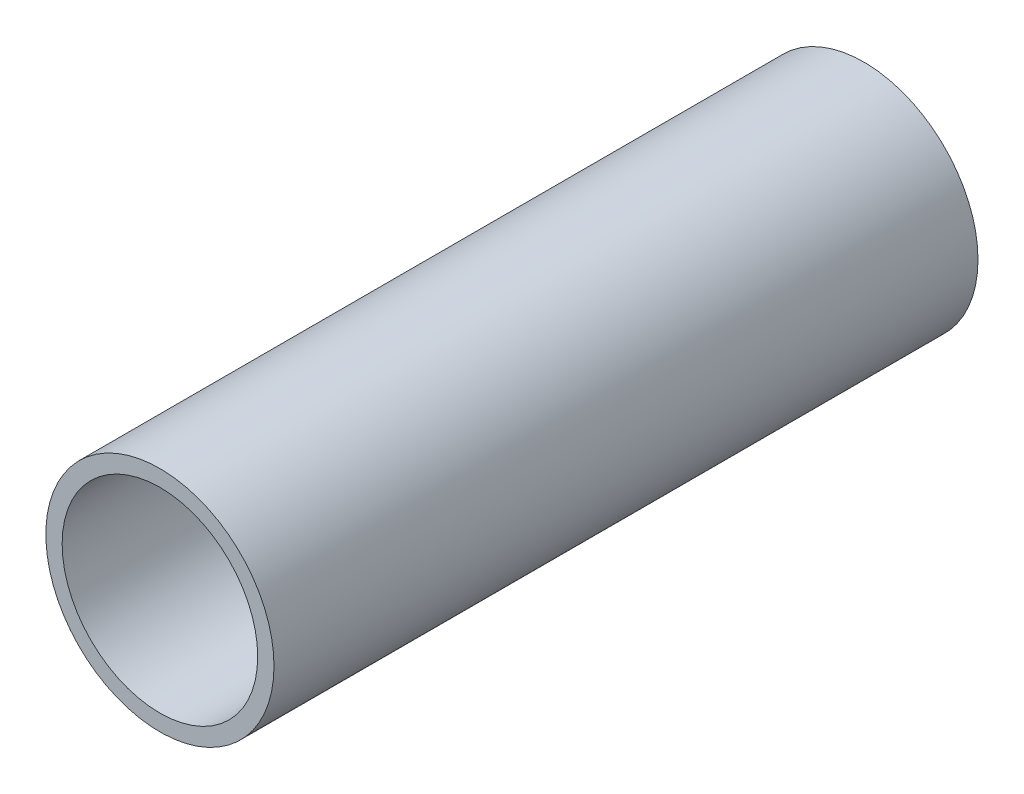
ISO-10303-21;
HEADER;
FILE_DESCRIPTION(('STEP AP214'),'2;1');
FILE_NAME('part.step','',(''),(''),'','','');
FILE_SCHEMA(('AUTOMOTIVE_DESIGN { 1 0 10303 214 1 1 1 1 }'));
ENDSEC;
DATA;
#1=APPLICATION_CONTEXT('core data for automotive mechanical design processes');
#2=APPLICATION_PROTOCOL_DEFINITION('international standard','automotive_design',2000,#1);
#3=PRODUCT_CONTEXT('',#1,'mechanical');
#4=PRODUCT('Part','Part','',(#3));
#5=PRODUCT_RELATED_PRODUCT_CATEGORY('part','',(#4));
#6=PRODUCT_DEFINITION_FORMATION('','',#4);
#7=PRODUCT_DEFINITION_CONTEXT('part definition',#1,'design');
#8=PRODUCT_DEFINITION('design','',#6,#7);
#9=PRODUCT_DEFINITION_SHAPE('','',#8);
#10=(LENGTH_UNIT() NAMED_UNIT(*) SI_UNIT(.MILLI.,.METRE.));
#11=(NAMED_UNIT(*) PLANE_ANGLE_UNIT() SI_UNIT($,.RADIAN.));
#12=(NAMED_UNIT(*) SI_UNIT($,.STERADIAN.) SOLID_ANGLE_UNIT());
#13=UNCERTAINTY_MEASURE_WITH_UNIT(LENGTH_MEASURE(1.E-05),#10,'distance_accuracy_value','');
#14=(GEOMETRIC_REPRESENTATION_CONTEXT(3) GLOBAL_UNCERTAINTY_ASSIGNED_CONTEXT((#13)) GLOBAL_UNIT_ASSIGNED_CONTEXT((#10,
#11,#12)) REPRESENTATION_CONTEXT('',''));
#15=CARTESIAN_POINT('',(0.,0.,0.));
#16=DIRECTION('',(0.,0.,1.));
#17=DIRECTION('',(1.,0.,0.));
#18=AXIS2_PLACEMENT_3D('',#15,#16,#17);
#19=CARTESIAN_POINT('',(0.,0.,-10.8));
#20=DIRECTION('',(0.,0.,1.));
#21=DIRECTION('',(1.,0.,0.));
#22=AXIS2_PLACEMENT_3D('',#19,#20,#21);
#23=CYLINDRICAL_SURFACE('',#22,1.75);
#24=CARTESIAN_POINT('',(0.,0.,-10.8));
#25=DIRECTION('',(0.,0.,1.));
#26=DIRECTION('',(1.,0.,0.));
#27=AXIS2_PLACEMENT_3D('',#24,#25,#26);
#28=CIRCLE('',#27,1.75);
#29=CARTESIAN_POINT('',(1.75,0.,-10.8));
#30=VERTEX_POINT('',#29);
#31=EDGE_CURVE('E10',#30,#30,#28,.T.);
#32=CARTESIAN_POINT('',(0.,0.,0.));
#33=DIRECTION('',(0.,0.,1.));
#34=DIRECTION('',(1.,0.,0.));
#35=AXIS2_PLACEMENT_3D('',#32,#33,#34);
#36=CIRCLE('',#35,1.75);
#37=CARTESIAN_POINT('',(1.75,0.,0.));
#38=VERTEX_POINT('',#37);
#39=EDGE_CURVE('E35',#38,#38,#36,.T.);
#40=CARTESIAN_POINT('',(1.75,0.,-10.8));
#41=CARTESIAN_POINT('',(1.75,0.,-10.6875));
#42=CARTESIAN_POINT('',(1.75,0.,-10.575));
#43=CARTESIAN_POINT('',(1.75,0.,-10.35));
#44=CARTESIAN_POINT('',(1.75,0.,-10.2375));
#45=CARTESIAN_POINT('',(1.75,0.,-10.0125));
#46=CARTESIAN_POINT('',(1.75,0.,-9.9));
#47=CARTESIAN_POINT('',(1.75,0.,-9.675));
#48=CARTESIAN_POINT('',(1.75,0.,-9.5625));
#49=CARTESIAN_POINT('',(1.75,0.,-9.3375));
#50=CARTESIAN_POINT('',(1.75,0.,-9.225));
#51=CARTESIAN_POINT('',(1.75,0.,-9.));
#52=CARTESIAN_POINT('',(1.75,0.,-8.8875));
#53=CARTESIAN_POINT('',(1.75,0.,-8.6625));
#54=CARTESIAN_POINT('',(1.75,0.,-8.55));
#55=CARTESIAN_POINT('',(1.75,0.,-8.325));
#56=CARTESIAN_POINT('',(1.75,0.,-8.2125));
#57=CARTESIAN_POINT('',(1.75,0.,-7.9875));
#58=CARTESIAN_POINT('',(1.75,0.,-7.875));
#59=CARTESIAN_POINT('',(1.75,0.,-7.65));
#60=CARTESIAN_POINT('',(1.75,0.,-7.5375));
#61=CARTESIAN_POINT('',(1.75,0.,-7.3125));
#62=CARTESIAN_POINT('',(1.75,0.,-7.2));
#63=CARTESIAN_POINT('',(1.75,0.,-6.975));
#64=CARTESIAN_POINT('',(1.75,0.,-6.8625));
#65=CARTESIAN_POINT('',(1.75,0.,-6.6375));
#66=CARTESIAN_POINT('',(1.75,0.,-6.525));
#67=CARTESIAN_POINT('',(1.75,0.,-6.3));
#68=CARTESIAN_POINT('',(1.75,0.,-6.1875));
#69=CARTESIAN_POINT('',(1.75,0.,-5.9625));
#70=CARTESIAN_POINT('',(1.75,0.,-5.85));
#71=CARTESIAN_POINT('',(1.75,0.,-5.625));
#72=CARTESIAN_POINT('',(1.75,0.,-5.5125));
#73=CARTESIAN_POINT('',(1.75,0.,-5.2875));
#74=CARTESIAN_POINT('',(1.75,0.,-5.175));
#75=CARTESIAN_POINT('',(1.75,0.,-4.95));
#76=CARTESIAN_POINT('',(1.75,0.,-4.8375));
#77=CARTESIAN_POINT('',(1.75,0.,-4.6125));
#78=CARTESIAN_POINT('',(1.75,0.,-4.5));
#79=CARTESIAN_POINT('',(1.75,0.,-4.275));
#80=CARTESIAN_POINT('',(1.75,0.,-4.1625));
#81=CARTESIAN_POINT('',(1.75,0.,-3.9375));
#82=CARTESIAN_POINT('',(1.75,0.,-3.825));
#83=CARTESIAN_POINT('',(1.75,0.,-3.6));
#84=CARTESIAN_POINT('',(1.75,0.,-3.4875));
#85=CARTESIAN_POINT('',(1.75,0.,-3.2625));
#86=CARTESIAN_POINT('',(1.75,0.,-3.15));
#87=CARTESIAN_POINT('',(1.75,0.,-2.925));
#88=CARTESIAN_POINT('',(1.75,0.,-2.8125));
#89=CARTESIAN_POINT('',(1.75,0.,-2.5875));
#90=CARTESIAN_POINT('',(1.75,0.,-2.475));
#91=CARTESIAN_POINT('',(1.75,0.,-2.25));
#92=CARTESIAN_POINT('',(1.75,0.,-2.1375));
#93=CARTESIAN_POINT('',(1.75,0.,-1.9125));
#94=CARTESIAN_POINT('',(1.75,0.,-1.8));
#95=CARTESIAN_POINT('',(1.75,0.,-1.575));
#96=CARTESIAN_POINT('',(1.75,0.,-1.4625));
#97=CARTESIAN_POINT('',(1.75,0.,-1.2375));
#98=CARTESIAN_POINT('',(1.75,0.,-1.125));
#99=CARTESIAN_POINT('',(1.75,0.,-0.900000000000001));
#100=CARTESIAN_POINT('',(1.75,0.,-0.787500000000002));
#101=CARTESIAN_POINT('',(1.75,0.,-0.562500000000002));
#102=CARTESIAN_POINT('',(1.75,0.,-0.450000000000001));
#103=CARTESIAN_POINT('',(1.75,0.,-0.225000000000001));
#104=CARTESIAN_POINT('',(1.75,0.,-0.112500000000001));
#105=CARTESIAN_POINT('',(1.75,0.,0.));
#106=B_SPLINE_CURVE_WITH_KNOTS('',3,(#40,#41,#42,#43,#44,#45,#46,#47,#48,#49,#50,#51,#52,#53,
#54,#55,#56,#57,#58,#59,#60,#61,#62,#63,#64,#65,#66,#67,#68,#69,#70,#71,#72,#73,#74,#75,#76,#77,
#78,#79,#80,#81,#82,#83,#84,#85,#86,#87,#88,#89,#90,#91,#92,#93,#94,#95,#96,#97,#98,#99,#100,
#101,#102,#103,#104,#105),.UNSPECIFIED.,.F.,.F.,(4,2,2,2,2,2,2,2,2,2,2,2,2,2,2,2,2,2,2,2,2,2,2,
2,2,2,2,2,2,2,2,2,4),(0.,0.337500000000001,0.675,1.0125,1.35,1.6875,2.025,2.3625,2.7,3.0375,
3.375,3.7125,4.05,4.3875,4.725,5.0625,5.4,5.7375,6.075,6.4125,6.75,7.0875,7.425,7.7625,8.1,
8.4375,8.775,9.1125,9.45,9.7875,10.125,10.4625,10.8),.UNSPECIFIED.);
#107=EDGE_CURVE('BSEAM32',#30,#38,#106,.T.);
#108=ORIENTED_EDGE('',*,*,#31,.T.);
#109=ORIENTED_EDGE('',*,*,#39,.F.);
#110=ORIENTED_EDGE('',*,*,#107,.T.);
#111=ORIENTED_EDGE('',*,*,#107,.F.);
#112=EDGE_LOOP('',(#108,#110,#109,#111));
#113=FACE_BOUND('',#112,.T.);
#114=ADVANCED_FACE('F32',(#113),#23,.T.);
#115=CARTESIAN_POINT('',(0.,0.,-10.8));
#116=DIRECTION('',(0.,0.,1.));
#117=DIRECTION('',(1.,0.,0.));
#118=AXIS2_PLACEMENT_3D('',#115,#116,#117);
#119=PLANE('',#118);
#120=CARTESIAN_POINT('',(0.,0.,-10.8));
#121=DIRECTION('',(0.,0.,1.));
#122=DIRECTION('',(1.,0.,0.));
#123=AXIS2_PLACEMENT_3D('',#120,#121,#122);
#124=CIRCLE('',#123,1.5);
#125=CARTESIAN_POINT('',(1.5,0.,-10.8));
#126=VERTEX_POINT('',#125);
#127=EDGE_CURVE('E42',#126,#126,#124,.T.);
#128=ORIENTED_EDGE('',*,*,#127,.T.);
#129=EDGE_LOOP('',(#128));
#130=FACE_BOUND('',#129,.T.);
#131=ORIENTED_EDGE('',*,*,#31,.F.);
#132=EDGE_LOOP('',(#131));
#133=FACE_BOUND('',#132,.T.);
#134=ADVANCED_FACE('F50',(#130,#133),#119,.F.);
#135=CARTESIAN_POINT('',(0.,0.,0.));
#136=DIRECTION('',(0.,0.,1.));
#137=DIRECTION('',(1.,0.,0.));
#138=AXIS2_PLACEMENT_3D('',#135,#136,#137);
#139=PLANE('',#138);
#140=CARTESIAN_POINT('',(0.,0.,0.));
#141=DIRECTION('',(0.,0.,1.));
#142=DIRECTION('',(1.,0.,0.));
#143=AXIS2_PLACEMENT_3D('',#140,#141,#142);
#144=CIRCLE('',#143,1.5);
#145=CARTESIAN_POINT('',(1.5,0.,0.));
#146=VERTEX_POINT('',#145);
#147=EDGE_CURVE('E44',#146,#146,#144,.T.);
#148=ORIENTED_EDGE('',*,*,#147,.F.);
#149=EDGE_LOOP('',(#148));
#150=FACE_BOUND('',#149,.T.);
#151=ORIENTED_EDGE('',*,*,#39,.T.);
#152=EDGE_LOOP('',(#151));
#153=FACE_BOUND('',#152,.T.);
#154=ADVANCED_FACE('F56',(#150,#153),#139,.T.);
#155=CARTESIAN_POINT('',(0.,0.,-10.8));
#156=DIRECTION('',(0.,0.,1.));
#157=DIRECTION('',(1.,0.,0.));
#158=AXIS2_PLACEMENT_3D('',#155,#156,#157);
#159=CYLINDRICAL_SURFACE('',#158,1.5);
#160=CARTESIAN_POINT('',(1.5,0.,-10.8));
#161=CARTESIAN_POINT('',(1.5,0.,-10.6875));
#162=CARTESIAN_POINT('',(1.5,0.,-10.575));
#163=CARTESIAN_POINT('',(1.5,0.,-10.35));
#164=CARTESIAN_POINT('',(1.5,0.,-10.2375));
#165=CARTESIAN_POINT('',(1.5,0.,-10.0125));
#166=CARTESIAN_POINT('',(1.5,0.,-9.9));
#167=CARTESIAN_POINT('',(1.5,0.,-9.675));
#168=CARTESIAN_POINT('',(1.5,0.,-9.5625));
#169=CARTESIAN_POINT('',(1.5,0.,-9.3375));
#170=CARTESIAN_POINT('',(1.5,0.,-9.225));
#171=CARTESIAN_POINT('',(1.5,0.,-9.));
#172=CARTESIAN_POINT('',(1.5,0.,-8.8875));
#173=CARTESIAN_POINT('',(1.5,0.,-8.6625));
#174=CARTESIAN_POINT('',(1.5,0.,-8.55));
#175=CARTESIAN_POINT('',(1.5,0.,-8.325));
#176=CARTESIAN_POINT('',(1.5,0.,-8.2125));
#177=CARTESIAN_POINT('',(1.5,0.,-7.9875));
#178=CARTESIAN_POINT('',(1.5,0.,-7.875));
#179=CARTESIAN_POINT('',(1.5,0.,-7.65));
#180=CARTESIAN_POINT('',(1.5,0.,-7.5375));
#181=CARTESIAN_POINT('',(1.5,0.,-7.3125));
#182=CARTESIAN_POINT('',(1.5,0.,-7.2));
#183=CARTESIAN_POINT('',(1.5,0.,-6.975));
#184=CARTESIAN_POINT('',(1.5,0.,-6.8625));
#185=CARTESIAN_POINT('',(1.5,0.,-6.6375));
#186=CARTESIAN_POINT('',(1.5,0.,-6.525));
#187=CARTESIAN_POINT('',(1.5,0.,-6.3));
#188=CARTESIAN_POINT('',(1.5,0.,-6.1875));
#189=CARTESIAN_POINT('',(1.5,0.,-5.9625));
#190=CARTESIAN_POINT('',(1.5,0.,-5.85));
#191=CARTESIAN_POINT('',(1.5,0.,-5.625));
#192=CARTESIAN_POINT('',(1.5,0.,-5.5125));
#193=CARTESIAN_POINT('',(1.5,0.,-5.2875));
#194=CARTESIAN_POINT('',(1.5,0.,-5.175));
#195=CARTESIAN_POINT('',(1.5,0.,-4.95));
#196=CARTESIAN_POINT('',(1.5,0.,-4.8375));
#197=CARTESIAN_POINT('',(1.5,0.,-4.6125));
#198=CARTESIAN_POINT('',(1.5,0.,-4.5));
#199=CARTESIAN_POINT('',(1.5,0.,-4.275));
#200=CARTESIAN_POINT('',(1.5,0.,-4.1625));
#201=CARTESIAN_POINT('',(1.5,0.,-3.9375));
#202=CARTESIAN_POINT('',(1.5,0.,-3.825));
#203=CARTESIAN_POINT('',(1.5,0.,-3.6));
#204=CARTESIAN_POINT('',(1.5,0.,-3.4875));
#205=CARTESIAN_POINT('',(1.5,0.,-3.2625));
#206=CARTESIAN_POINT('',(1.5,0.,-3.15));
#207=CARTESIAN_POINT('',(1.5,0.,-2.925));
#208=CARTESIAN_POINT('',(1.5,0.,-2.8125));
#209=CARTESIAN_POINT('',(1.5,0.,-2.5875));
#210=CARTESIAN_POINT('',(1.5,0.,-2.475));
#211=CARTESIAN_POINT('',(1.5,0.,-2.25));
#212=CARTESIAN_POINT('',(1.5,0.,-2.1375));
#213=CARTESIAN_POINT('',(1.5,0.,-1.9125));
#214=CARTESIAN_POINT('',(1.5,0.,-1.8));
#215=CARTESIAN_POINT('',(1.5,0.,-1.575));
#216=CARTESIAN_POINT('',(1.5,0.,-1.4625));
#217=CARTESIAN_POINT('',(1.5,0.,-1.2375));
#218=CARTESIAN_POINT('',(1.5,0.,-1.125));
#219=CARTESIAN_POINT('',(1.5,0.,-0.900000000000001));
#220=CARTESIAN_POINT('',(1.5,0.,-0.787500000000002));
#221=CARTESIAN_POINT('',(1.5,0.,-0.562500000000002));
#222=CARTESIAN_POINT('',(1.5,0.,-0.450000000000001));
#223=CARTESIAN_POINT('',(1.5,0.,-0.225000000000001));
#224=CARTESIAN_POINT('',(1.5,0.,-0.112500000000001));
#225=CARTESIAN_POINT('',(1.5,0.,0.));
#226=B_SPLINE_CURVE_WITH_KNOTS('',3,(#160,#161,#162,#163,#164,#165,#166,#167,#168,#169,#170,
#171,#172,#173,#174,#175,#176,#177,#178,#179,#180,#181,#182,#183,#184,#185,#186,#187,#188,#189,
#190,#191,#192,#193,#194,#195,#196,#197,#198,#199,#200,#201,#202,#203,#204,#205,#206,#207,#208,
#209,#210,#211,#212,#213,#214,#215,#216,#217,#218,#219,#220,#221,#222,#223,#224,#225),
.UNSPECIFIED.,.F.,.F.,(4,2,2,2,2,2,2,2,2,2,2,2,2,2,2,2,2,2,2,2,2,2,2,2,2,2,2,2,2,2,2,2,4),(0.,
0.337500000000001,0.675,1.0125,1.35,1.6875,2.025,2.3625,2.7,3.0375,3.375,3.7125,4.05,4.3875,
4.725,5.0625,5.4,5.7375,6.075,6.4125,6.75,7.0875,7.425,7.7625,8.1,8.4375,8.775,9.1125,9.45,
9.7875,10.125,10.4625,10.8),.UNSPECIFIED.);
#227=EDGE_CURVE('BSEAM53',#126,#146,#226,.T.);
#228=ORIENTED_EDGE('',*,*,#127,.F.);
#229=ORIENTED_EDGE('',*,*,#147,.T.);
#230=ORIENTED_EDGE('',*,*,#227,.T.);
#231=ORIENTED_EDGE('',*,*,#227,.F.);
#232=EDGE_LOOP('',(#228,#230,#229,#231));
#233=FACE_BOUND('',#232,.T.);
#234=ADVANCED_FACE('F53',(#233),#159,.F.);
#235=CLOSED_SHELL('',(#114,#134,#154,#234));
#236=MANIFOLD_SOLID_BREP('B2',#235);
#237=ADVANCED_BREP_SHAPE_REPRESENTATION('',(#18,#236),#14);
#238=SHAPE_DEFINITION_REPRESENTATION(#9,#237);
ENDSEC;
END-ISO-10303-21;
